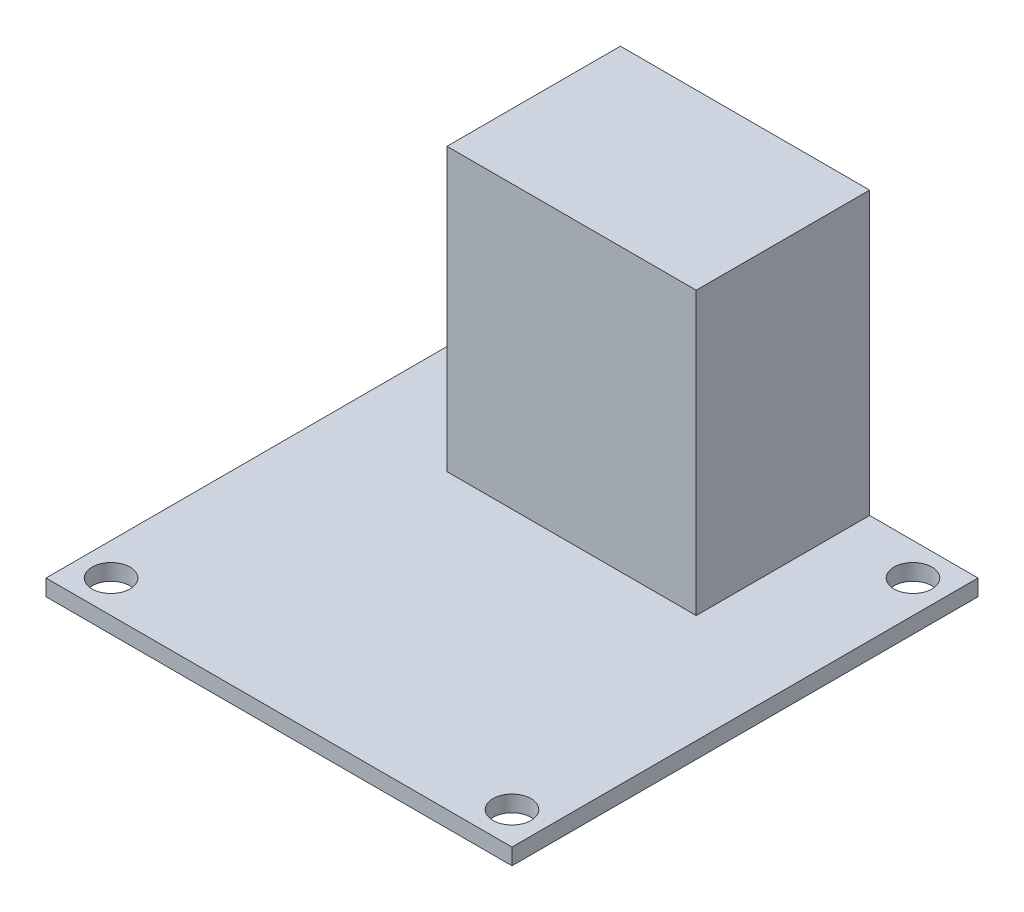
ISO-10303-21;
HEADER;
FILE_DESCRIPTION(('STEP AP214'),'2;1');
FILE_NAME('part.step','',(''),(''),'','','');
FILE_SCHEMA(('AUTOMOTIVE_DESIGN { 1 0 10303 214 1 1 1 1 }'));
ENDSEC;
DATA;
#1=APPLICATION_CONTEXT('core data for automotive mechanical design processes');
#2=APPLICATION_PROTOCOL_DEFINITION('international standard','automotive_design',2000,#1);
#3=PRODUCT_CONTEXT('',#1,'mechanical');
#4=PRODUCT('Part','Part','',(#3));
#5=PRODUCT_RELATED_PRODUCT_CATEGORY('part','',(#4));
#6=PRODUCT_DEFINITION_FORMATION('','',#4);
#7=PRODUCT_DEFINITION_CONTEXT('part definition',#1,'design');
#8=PRODUCT_DEFINITION('design','',#6,#7);
#9=PRODUCT_DEFINITION_SHAPE('','',#8);
#10=(LENGTH_UNIT() NAMED_UNIT(*) SI_UNIT(.MILLI.,.METRE.));
#11=(NAMED_UNIT(*) PLANE_ANGLE_UNIT() SI_UNIT($,.RADIAN.));
#12=(NAMED_UNIT(*) SI_UNIT($,.STERADIAN.) SOLID_ANGLE_UNIT());
#13=UNCERTAINTY_MEASURE_WITH_UNIT(LENGTH_MEASURE(1.E-05),#10,'distance_accuracy_value','');
#14=(GEOMETRIC_REPRESENTATION_CONTEXT(3) GLOBAL_UNCERTAINTY_ASSIGNED_CONTEXT((#13)) GLOBAL_UNIT_ASSIGNED_CONTEXT((#10,
#11,#12)) REPRESENTATION_CONTEXT('',''));
#15=CARTESIAN_POINT('',(0.,0.,0.));
#16=DIRECTION('',(0.,0.,1.));
#17=DIRECTION('',(1.,0.,0.));
#18=AXIS2_PLACEMENT_3D('',#15,#16,#17);
#19=CARTESIAN_POINT('',(0.,1.5,0.));
#20=DIRECTION('',(0.,1.,0.));
#21=DIRECTION('',(0.,0.,1.));
#22=AXIS2_PLACEMENT_3D('',#19,#20,#21);
#23=PLANE('',#22);
#24=CARTESIAN_POINT('',(18.5,1.5,-18.5));
#25=DIRECTION('',(0.,1.,0.));
#26=DIRECTION('',(0.,0.,-1.));
#27=AXIS2_PLACEMENT_3D('',#24,#25,#26);
#28=CIRCLE('',#27,1.75);
#29=CARTESIAN_POINT('',(18.5,1.5,-20.25));
#30=VERTEX_POINT('',#29);
#31=EDGE_CURVE('E141',#30,#30,#28,.T.);
#32=ORIENTED_EDGE('',*,*,#31,.F.);
#33=EDGE_LOOP('',(#32));
#34=FACE_BOUND('',#33,.T.);
#35=CARTESIAN_POINT('',(-18.5,1.5,18.5));
#36=DIRECTION('',(0.,1.,0.));
#37=DIRECTION('',(0.,0.,-1.));
#38=AXIS2_PLACEMENT_3D('',#35,#36,#37);
#39=CIRCLE('',#38,1.75);
#40=CARTESIAN_POINT('',(-18.5,1.5,16.75));
#41=VERTEX_POINT('',#40);
#42=EDGE_CURVE('E135',#41,#41,#39,.T.);
#43=ORIENTED_EDGE('',*,*,#42,.F.);
#44=EDGE_LOOP('',(#43));
#45=FACE_BOUND('',#44,.T.);
#46=CARTESIAN_POINT('',(18.5,1.5,18.5));
#47=DIRECTION('',(0.,1.,0.));
#48=DIRECTION('',(0.,0.,1.));
#49=AXIS2_PLACEMENT_3D('',#46,#47,#48);
#50=CIRCLE('',#49,1.75);
#51=CARTESIAN_POINT('',(18.5,1.5,20.25));
#52=VERTEX_POINT('',#51);
#53=EDGE_CURVE('E125',#52,#52,#50,.T.);
#54=ORIENTED_EDGE('',*,*,#53,.F.);
#55=EDGE_LOOP('',(#54));
#56=FACE_BOUND('',#55,.T.);
#57=CARTESIAN_POINT('',(-18.5,1.5,-18.5));
#58=DIRECTION('',(0.,1.,0.));
#59=DIRECTION('',(0.,0.,1.));
#60=AXIS2_PLACEMENT_3D('',#57,#58,#59);
#61=CIRCLE('',#60,1.75);
#62=CARTESIAN_POINT('',(-18.5,1.5,-16.75));
#63=VERTEX_POINT('',#62);
#64=EDGE_CURVE('E140',#63,#63,#61,.T.);
#65=ORIENTED_EDGE('',*,*,#64,.F.);
#66=EDGE_LOOP('',(#65));
#67=FACE_BOUND('',#66,.T.);
#68=DIRECTION('',(-1.,0.,0.));
#69=VECTOR('',#68,1.);
#70=CARTESIAN_POINT('',(-21.5,1.5,-21.5));
#71=LINE('',#70,#69);
#72=CARTESIAN_POINT('',(21.5,1.5,-21.5));
#73=VERTEX_POINT('',#72);
#74=CARTESIAN_POINT('',(11.5,1.5,-21.5));
#75=VERTEX_POINT('',#74);
#76=EDGE_CURVE('E159',#73,#75,#71,.T.);
#77=ORIENTED_EDGE('',*,*,#76,.T.);
#78=DIRECTION('',(0.,0.,1.));
#79=VECTOR('',#78,1.);
#80=CARTESIAN_POINT('',(11.5,1.5,0.));
#81=LINE('',#80,#79);
#82=CARTESIAN_POINT('',(11.5,1.5,-5.50000000000001));
#83=VERTEX_POINT('',#82);
#84=EDGE_CURVE('E52',#75,#83,#81,.T.);
#85=ORIENTED_EDGE('',*,*,#84,.T.);
#86=DIRECTION('',(-1.,0.,0.));
#87=VECTOR('',#86,1.);
#88=CARTESIAN_POINT('',(0.,1.5,-5.50000000000001));
#89=LINE('',#88,#87);
#90=CARTESIAN_POINT('',(-11.5,1.5,-5.5));
#91=VERTEX_POINT('',#90);
#92=EDGE_CURVE('E199',#83,#91,#89,.T.);
#93=ORIENTED_EDGE('',*,*,#92,.T.);
#94=DIRECTION('',(0.,0.,1.));
#95=VECTOR('',#94,1.);
#96=CARTESIAN_POINT('',(-11.5,1.5,0.));
#97=LINE('',#96,#95);
#98=CARTESIAN_POINT('',(-11.5,1.5,-21.5));
#99=VERTEX_POINT('',#98);
#100=EDGE_CURVE('E58',#99,#91,#97,.T.);
#101=ORIENTED_EDGE('',*,*,#100,.F.);
#102=CARTESIAN_POINT('',(-21.5,1.5,-21.5));
#103=VERTEX_POINT('',#102);
#104=EDGE_CURVE('E124',#99,#103,#71,.T.);
#105=ORIENTED_EDGE('',*,*,#104,.T.);
#106=DIRECTION('',(0.,0.,1.));
#107=VECTOR('',#106,1.);
#108=CARTESIAN_POINT('',(-21.5,1.5,-21.5));
#109=LINE('',#108,#107);
#110=CARTESIAN_POINT('',(-21.5,1.5,21.5));
#111=VERTEX_POINT('',#110);
#112=EDGE_CURVE('E161',#103,#111,#109,.T.);
#113=ORIENTED_EDGE('',*,*,#112,.T.);
#114=DIRECTION('',(1.,0.,0.));
#115=VECTOR('',#114,1.);
#116=CARTESIAN_POINT('',(-21.5,1.5,21.5));
#117=LINE('',#116,#115);
#118=CARTESIAN_POINT('',(21.5,1.5,21.5));
#119=VERTEX_POINT('',#118);
#120=EDGE_CURVE('E163',#111,#119,#117,.T.);
#121=ORIENTED_EDGE('',*,*,#120,.T.);
#122=DIRECTION('',(0.,0.,-1.));
#123=VECTOR('',#122,1.);
#124=CARTESIAN_POINT('',(21.5,1.5,-21.5));
#125=LINE('',#124,#123);
#126=EDGE_CURVE('E155',#119,#73,#125,.T.);
#127=ORIENTED_EDGE('',*,*,#126,.T.);
#128=EDGE_LOOP('',(#77,#85,#93,#101,#105,#113,#121,#127));
#129=FACE_BOUND('',#128,.T.);
#130=ADVANCED_FACE('F37',(#34,#45,#56,#67,#129),#23,.T.);
#131=CARTESIAN_POINT('',(21.5,1.5,-21.5));
#132=DIRECTION('',(-1.,0.,0.));
#133=DIRECTION('',(0.,0.,1.));
#134=AXIS2_PLACEMENT_3D('',#131,#132,#133);
#135=PLANE('',#134);
#136=DIRECTION('',(0.,0.,-1.));
#137=VECTOR('',#136,1.);
#138=CARTESIAN_POINT('',(21.5,0.,-21.5));
#139=LINE('',#138,#137);
#140=CARTESIAN_POINT('',(21.5,0.,21.5));
#141=VERTEX_POINT('',#140);
#142=CARTESIAN_POINT('',(21.5,0.,-21.5));
#143=VERTEX_POINT('',#142);
#144=EDGE_CURVE('E152',#141,#143,#139,.T.);
#145=ORIENTED_EDGE('',*,*,#144,.T.);
#146=DIRECTION('',(0.,-1.,0.));
#147=VECTOR('',#146,1.);
#148=CARTESIAN_POINT('',(21.5,1.5,-21.5));
#149=LINE('',#148,#147);
#150=EDGE_CURVE('E11',#73,#143,#149,.T.);
#151=ORIENTED_EDGE('',*,*,#150,.F.);
#152=ORIENTED_EDGE('',*,*,#126,.F.);
#153=DIRECTION('',(0.,-1.,0.));
#154=VECTOR('',#153,1.);
#155=CARTESIAN_POINT('',(21.5,1.5,21.5));
#156=LINE('',#155,#154);
#157=EDGE_CURVE('E165',#119,#141,#156,.T.);
#158=ORIENTED_EDGE('',*,*,#157,.T.);
#159=EDGE_LOOP('',(#145,#151,#152,#158));
#160=FACE_BOUND('',#159,.T.);
#161=ADVANCED_FACE('F39',(#160),#135,.F.);
#162=CARTESIAN_POINT('',(-21.5,1.5,-21.5));
#163=DIRECTION('',(0.,0.,1.));
#164=DIRECTION('',(1.,0.,0.));
#165=AXIS2_PLACEMENT_3D('',#162,#163,#164);
#166=PLANE('',#165);
#167=DIRECTION('',(-1.,0.,0.));
#168=VECTOR('',#167,1.);
#169=CARTESIAN_POINT('',(-21.5,0.,-21.5));
#170=LINE('',#169,#168);
#171=CARTESIAN_POINT('',(-21.5,0.,-21.5));
#172=VERTEX_POINT('',#171);
#173=EDGE_CURVE('E168',#143,#172,#170,.T.);
#174=ORIENTED_EDGE('',*,*,#173,.T.);
#175=DIRECTION('',(0.,-1.,0.));
#176=VECTOR('',#175,1.);
#177=CARTESIAN_POINT('',(-21.5,1.5,-21.5));
#178=LINE('',#177,#176);
#179=EDGE_CURVE('E45',#103,#172,#178,.T.);
#180=ORIENTED_EDGE('',*,*,#179,.F.);
#181=ORIENTED_EDGE('',*,*,#104,.F.);
#182=DIRECTION('',(0.,-1.,0.));
#183=VECTOR('',#182,1.);
#184=CARTESIAN_POINT('',(-11.5,27.5,-21.5));
#185=LINE('',#184,#183);
#186=CARTESIAN_POINT('',(-11.5,27.5,-21.5));
#187=VERTEX_POINT('',#186);
#188=EDGE_CURVE('E105',#187,#99,#185,.T.);
#189=ORIENTED_EDGE('',*,*,#188,.F.);
#190=DIRECTION('',(-1.,0.,0.));
#191=VECTOR('',#190,1.);
#192=CARTESIAN_POINT('',(0.,27.5,-21.5));
#193=LINE('',#192,#191);
#194=CARTESIAN_POINT('',(11.5,27.5,-21.5));
#195=VERTEX_POINT('',#194);
#196=EDGE_CURVE('E112',#195,#187,#193,.T.);
#197=ORIENTED_EDGE('',*,*,#196,.F.);
#198=DIRECTION('',(0.,-1.,0.));
#199=VECTOR('',#198,1.);
#200=CARTESIAN_POINT('',(11.5,27.5,-21.5));
#201=LINE('',#200,#199);
#202=EDGE_CURVE('E194',#195,#75,#201,.T.);
#203=ORIENTED_EDGE('',*,*,#202,.T.);
#204=ORIENTED_EDGE('',*,*,#76,.F.);
#205=ORIENTED_EDGE('',*,*,#150,.T.);
#206=EDGE_LOOP('',(#174,#180,#181,#189,#197,#203,#204,#205));
#207=FACE_BOUND('',#206,.T.);
#208=ADVANCED_FACE('F122',(#207),#166,.F.);
#209=CARTESIAN_POINT('',(-21.5,1.5,-21.5));
#210=DIRECTION('',(1.,0.,0.));
#211=DIRECTION('',(0.,0.,-1.));
#212=AXIS2_PLACEMENT_3D('',#209,#210,#211);
#213=PLANE('',#212);
#214=DIRECTION('',(0.,0.,1.));
#215=VECTOR('',#214,1.);
#216=CARTESIAN_POINT('',(-21.5,0.,-21.5));
#217=LINE('',#216,#215);
#218=CARTESIAN_POINT('',(-21.5,0.,21.5));
#219=VERTEX_POINT('',#218);
#220=EDGE_CURVE('E170',#172,#219,#217,.T.);
#221=ORIENTED_EDGE('',*,*,#220,.T.);
#222=DIRECTION('',(0.,-1.,0.));
#223=VECTOR('',#222,1.);
#224=CARTESIAN_POINT('',(-21.5,1.5,21.5));
#225=LINE('',#224,#223);
#226=EDGE_CURVE('E175',#111,#219,#225,.T.);
#227=ORIENTED_EDGE('',*,*,#226,.F.);
#228=ORIENTED_EDGE('',*,*,#112,.F.);
#229=ORIENTED_EDGE('',*,*,#179,.T.);
#230=EDGE_LOOP('',(#221,#227,#228,#229));
#231=FACE_BOUND('',#230,.T.);
#232=ADVANCED_FACE('F181',(#231),#213,.F.);
#233=CARTESIAN_POINT('',(-21.5,1.5,21.5));
#234=DIRECTION('',(0.,0.,-1.));
#235=DIRECTION('',(-1.,0.,0.));
#236=AXIS2_PLACEMENT_3D('',#233,#234,#235);
#237=PLANE('',#236);
#238=DIRECTION('',(1.,0.,0.));
#239=VECTOR('',#238,1.);
#240=CARTESIAN_POINT('',(-21.5,0.,21.5));
#241=LINE('',#240,#239);
#242=EDGE_CURVE('E158',#219,#141,#241,.T.);
#243=ORIENTED_EDGE('',*,*,#242,.T.);
#244=ORIENTED_EDGE('',*,*,#157,.F.);
#245=ORIENTED_EDGE('',*,*,#120,.F.);
#246=ORIENTED_EDGE('',*,*,#226,.T.);
#247=EDGE_LOOP('',(#243,#244,#245,#246));
#248=FACE_BOUND('',#247,.T.);
#249=ADVANCED_FACE('F189',(#248),#237,.F.);
#250=CARTESIAN_POINT('',(0.,0.,0.));
#251=DIRECTION('',(0.,1.,0.));
#252=DIRECTION('',(0.,0.,1.));
#253=AXIS2_PLACEMENT_3D('',#250,#251,#252);
#254=PLANE('',#253);
#255=CARTESIAN_POINT('',(18.5,0.,-18.5));
#256=DIRECTION('',(0.,1.,0.));
#257=DIRECTION('',(0.,0.,-1.));
#258=AXIS2_PLACEMENT_3D('',#255,#256,#257);
#259=CIRCLE('',#258,1.75);
#260=CARTESIAN_POINT('',(18.5,0.,-20.25));
#261=VERTEX_POINT('',#260);
#262=EDGE_CURVE('E137',#261,#261,#259,.T.);
#263=ORIENTED_EDGE('',*,*,#262,.T.);
#264=EDGE_LOOP('',(#263));
#265=FACE_BOUND('',#264,.T.);
#266=CARTESIAN_POINT('',(-18.5,0.,18.5));
#267=DIRECTION('',(0.,1.,0.));
#268=DIRECTION('',(0.,0.,-1.));
#269=AXIS2_PLACEMENT_3D('',#266,#267,#268);
#270=CIRCLE('',#269,1.75);
#271=CARTESIAN_POINT('',(-18.5,0.,16.75));
#272=VERTEX_POINT('',#271);
#273=EDGE_CURVE('E144',#272,#272,#270,.T.);
#274=ORIENTED_EDGE('',*,*,#273,.T.);
#275=EDGE_LOOP('',(#274));
#276=FACE_BOUND('',#275,.T.);
#277=CARTESIAN_POINT('',(18.5,0.,18.5));
#278=DIRECTION('',(0.,1.,0.));
#279=DIRECTION('',(0.,0.,1.));
#280=AXIS2_PLACEMENT_3D('',#277,#278,#279);
#281=CIRCLE('',#280,1.75);
#282=CARTESIAN_POINT('',(18.5,0.,20.25));
#283=VERTEX_POINT('',#282);
#284=EDGE_CURVE('E128',#283,#283,#281,.T.);
#285=ORIENTED_EDGE('',*,*,#284,.T.);
#286=EDGE_LOOP('',(#285));
#287=FACE_BOUND('',#286,.T.);
#288=CARTESIAN_POINT('',(-18.5,0.,-18.5));
#289=DIRECTION('',(0.,1.,0.));
#290=DIRECTION('',(0.,0.,1.));
#291=AXIS2_PLACEMENT_3D('',#288,#289,#290);
#292=CIRCLE('',#291,1.75);
#293=CARTESIAN_POINT('',(-18.5,0.,-16.75));
#294=VERTEX_POINT('',#293);
#295=EDGE_CURVE('E149',#294,#294,#292,.T.);
#296=ORIENTED_EDGE('',*,*,#295,.T.);
#297=EDGE_LOOP('',(#296));
#298=FACE_BOUND('',#297,.T.);
#299=ORIENTED_EDGE('',*,*,#144,.F.);
#300=ORIENTED_EDGE('',*,*,#242,.F.);
#301=ORIENTED_EDGE('',*,*,#220,.F.);
#302=ORIENTED_EDGE('',*,*,#173,.F.);
#303=EDGE_LOOP('',(#299,#300,#301,#302));
#304=FACE_BOUND('',#303,.T.);
#305=ADVANCED_FACE('F186',(#265,#276,#287,#298,#304),#254,.F.);
#306=CARTESIAN_POINT('',(-18.5,0.,-18.5));
#307=DIRECTION('',(0.,1.,0.));
#308=DIRECTION('',(0.,0.,1.));
#309=AXIS2_PLACEMENT_3D('',#306,#307,#308);
#310=CYLINDRICAL_SURFACE('',#309,1.75);
#311=ORIENTED_EDGE('',*,*,#295,.F.);
#312=EDGE_LOOP('',(#311));
#313=FACE_BOUND('',#312,.T.);
#314=ORIENTED_EDGE('',*,*,#64,.T.);
#315=EDGE_LOOP('',(#314));
#316=FACE_BOUND('',#315,.T.);
#317=ADVANCED_FACE('F226',(#313,#316),#310,.F.);
#318=CARTESIAN_POINT('',(18.5,0.,18.5));
#319=DIRECTION('',(0.,1.,0.));
#320=DIRECTION('',(0.,0.,1.));
#321=AXIS2_PLACEMENT_3D('',#318,#319,#320);
#322=CYLINDRICAL_SURFACE('',#321,1.75);
#323=ORIENTED_EDGE('',*,*,#284,.F.);
#324=EDGE_LOOP('',(#323));
#325=FACE_BOUND('',#324,.T.);
#326=ORIENTED_EDGE('',*,*,#53,.T.);
#327=EDGE_LOOP('',(#326));
#328=FACE_BOUND('',#327,.T.);
#329=ADVANCED_FACE('F258',(#325,#328),#322,.F.);
#330=CARTESIAN_POINT('',(-18.5,0.,18.5));
#331=DIRECTION('',(0.,1.,0.));
#332=DIRECTION('',(0.,0.,1.));
#333=AXIS2_PLACEMENT_3D('',#330,#331,#332);
#334=CYLINDRICAL_SURFACE('',#333,1.75);
#335=ORIENTED_EDGE('',*,*,#273,.F.);
#336=EDGE_LOOP('',(#335));
#337=FACE_BOUND('',#336,.T.);
#338=ORIENTED_EDGE('',*,*,#42,.T.);
#339=EDGE_LOOP('',(#338));
#340=FACE_BOUND('',#339,.T.);
#341=ADVANCED_FACE('F265',(#337,#340),#334,.F.);
#342=CARTESIAN_POINT('',(18.5,0.,-18.5));
#343=DIRECTION('',(0.,1.,0.));
#344=DIRECTION('',(0.,0.,1.));
#345=AXIS2_PLACEMENT_3D('',#342,#343,#344);
#346=CYLINDRICAL_SURFACE('',#345,1.75);
#347=ORIENTED_EDGE('',*,*,#262,.F.);
#348=EDGE_LOOP('',(#347));
#349=FACE_BOUND('',#348,.T.);
#350=ORIENTED_EDGE('',*,*,#31,.T.);
#351=EDGE_LOOP('',(#350));
#352=FACE_BOUND('',#351,.T.);
#353=ADVANCED_FACE('F214',(#349,#352),#346,.F.);
#354=CARTESIAN_POINT('',(-11.5,27.5,0.));
#355=DIRECTION('',(1.,0.,0.));
#356=DIRECTION('',(0.,0.,-1.));
#357=AXIS2_PLACEMENT_3D('',#354,#355,#356);
#358=PLANE('',#357);
#359=ORIENTED_EDGE('',*,*,#100,.T.);
#360=DIRECTION('',(0.,-1.,0.));
#361=VECTOR('',#360,1.);
#362=CARTESIAN_POINT('',(-11.5,27.5,-5.5));
#363=LINE('',#362,#361);
#364=CARTESIAN_POINT('',(-11.5,27.5,-5.5));
#365=VERTEX_POINT('',#364);
#366=EDGE_CURVE('E107',#365,#91,#363,.T.);
#367=ORIENTED_EDGE('',*,*,#366,.F.);
#368=DIRECTION('',(0.,0.,1.));
#369=VECTOR('',#368,1.);
#370=CARTESIAN_POINT('',(-11.5,27.5,0.));
#371=LINE('',#370,#369);
#372=EDGE_CURVE('E101',#187,#365,#371,.T.);
#373=ORIENTED_EDGE('',*,*,#372,.F.);
#374=ORIENTED_EDGE('',*,*,#188,.T.);
#375=EDGE_LOOP('',(#359,#367,#373,#374));
#376=FACE_BOUND('',#375,.T.);
#377=ADVANCED_FACE('F103',(#376),#358,.F.);
#378=CARTESIAN_POINT('',(0.,27.5,-5.50000000000001));
#379=DIRECTION('',(0.,0.,1.));
#380=DIRECTION('',(1.,0.,0.));
#381=AXIS2_PLACEMENT_3D('',#378,#379,#380);
#382=PLANE('',#381);
#383=ORIENTED_EDGE('',*,*,#92,.F.);
#384=DIRECTION('',(0.,-1.,0.));
#385=VECTOR('',#384,1.);
#386=CARTESIAN_POINT('',(11.5,27.5,-5.50000000000001));
#387=LINE('',#386,#385);
#388=CARTESIAN_POINT('',(11.5,27.5,-5.50000000000001));
#389=VERTEX_POINT('',#388);
#390=EDGE_CURVE('E130',#389,#83,#387,.T.);
#391=ORIENTED_EDGE('',*,*,#390,.F.);
#392=DIRECTION('',(-1.,0.,0.));
#393=VECTOR('',#392,1.);
#394=CARTESIAN_POINT('',(0.,27.5,-5.50000000000001));
#395=LINE('',#394,#393);
#396=EDGE_CURVE('E111',#389,#365,#395,.T.);
#397=ORIENTED_EDGE('',*,*,#396,.T.);
#398=ORIENTED_EDGE('',*,*,#366,.T.);
#399=EDGE_LOOP('',(#383,#391,#397,#398));
#400=FACE_BOUND('',#399,.T.);
#401=ADVANCED_FACE('F206',(#400),#382,.T.);
#402=CARTESIAN_POINT('',(11.5,27.5,0.));
#403=DIRECTION('',(1.,0.,0.));
#404=DIRECTION('',(0.,0.,-1.));
#405=AXIS2_PLACEMENT_3D('',#402,#403,#404);
#406=PLANE('',#405);
#407=ORIENTED_EDGE('',*,*,#84,.F.);
#408=ORIENTED_EDGE('',*,*,#202,.F.);
#409=DIRECTION('',(0.,0.,1.));
#410=VECTOR('',#409,1.);
#411=CARTESIAN_POINT('',(11.5,27.5,0.));
#412=LINE('',#411,#410);
#413=EDGE_CURVE('E118',#195,#389,#412,.T.);
#414=ORIENTED_EDGE('',*,*,#413,.T.);
#415=ORIENTED_EDGE('',*,*,#390,.T.);
#416=EDGE_LOOP('',(#407,#408,#414,#415));
#417=FACE_BOUND('',#416,.T.);
#418=ADVANCED_FACE('F197',(#417),#406,.T.);
#419=CARTESIAN_POINT('',(0.,27.5,0.));
#420=DIRECTION('',(0.,1.,0.));
#421=DIRECTION('',(0.,0.,1.));
#422=AXIS2_PLACEMENT_3D('',#419,#420,#421);
#423=PLANE('',#422);
#424=ORIENTED_EDGE('',*,*,#196,.T.);
#425=ORIENTED_EDGE('',*,*,#372,.T.);
#426=ORIENTED_EDGE('',*,*,#396,.F.);
#427=ORIENTED_EDGE('',*,*,#413,.F.);
#428=EDGE_LOOP('',(#424,#425,#426,#427));
#429=FACE_BOUND('',#428,.T.);
#430=ADVANCED_FACE('F116',(#429),#423,.T.);
#431=CLOSED_SHELL('',(#130,#161,#208,#232,#249,#305,#317,#329,#341,#353,#377,#401,#418,#430));
#432=MANIFOLD_SOLID_BREP('B2',#431);
#433=ADVANCED_BREP_SHAPE_REPRESENTATION('',(#18,#432),#14);
#434=SHAPE_DEFINITION_REPRESENTATION(#9,#433);
ENDSEC;
END-ISO-10303-21;
